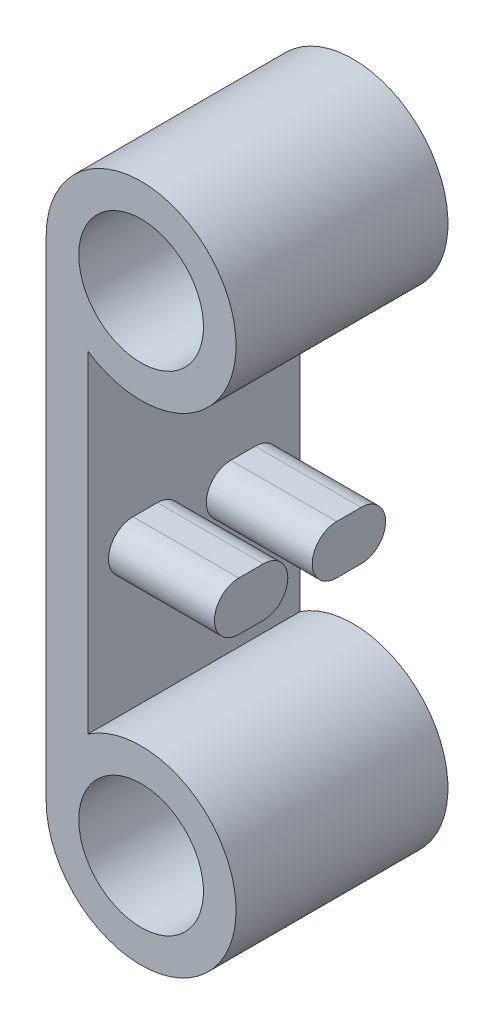
ISO-10303-21;
HEADER;
FILE_DESCRIPTION(('STEP AP214'),'2;1');
FILE_NAME('part.step','',(''),(''),'','','');
FILE_SCHEMA(('AUTOMOTIVE_DESIGN { 1 0 10303 214 1 1 1 1 }'));
ENDSEC;
DATA;
#1=APPLICATION_CONTEXT('core data for automotive mechanical design processes');
#2=APPLICATION_PROTOCOL_DEFINITION('international standard','automotive_design',2000,#1);
#3=PRODUCT_CONTEXT('',#1,'mechanical');
#4=PRODUCT('Part','Part','',(#3));
#5=PRODUCT_RELATED_PRODUCT_CATEGORY('part','',(#4));
#6=PRODUCT_DEFINITION_FORMATION('','',#4);
#7=PRODUCT_DEFINITION_CONTEXT('part definition',#1,'design');
#8=PRODUCT_DEFINITION('design','',#6,#7);
#9=PRODUCT_DEFINITION_SHAPE('','',#8);
#10=(LENGTH_UNIT() NAMED_UNIT(*) SI_UNIT(.MILLI.,.METRE.));
#11=(NAMED_UNIT(*) PLANE_ANGLE_UNIT() SI_UNIT($,.RADIAN.));
#12=(NAMED_UNIT(*) SI_UNIT($,.STERADIAN.) SOLID_ANGLE_UNIT());
#13=UNCERTAINTY_MEASURE_WITH_UNIT(LENGTH_MEASURE(1.E-05),#10,'distance_accuracy_value','');
#14=(GEOMETRIC_REPRESENTATION_CONTEXT(3) GLOBAL_UNCERTAINTY_ASSIGNED_CONTEXT((#13)) GLOBAL_UNIT_ASSIGNED_CONTEXT((#10,
#11,#12)) REPRESENTATION_CONTEXT('',''));
#15=CARTESIAN_POINT('',(0.,0.,0.));
#16=DIRECTION('',(0.,0.,1.));
#17=DIRECTION('',(1.,0.,0.));
#18=AXIS2_PLACEMENT_3D('',#15,#16,#17);
#19=CARTESIAN_POINT('',(-6.50000000000001,20.3318822928142,26.));
#20=DIRECTION('',(-1.,0.,0.));
#21=DIRECTION('',(0.,-1.,0.));
#22=AXIS2_PLACEMENT_3D('',#19,#20,#21);
#23=PLANE('',#22);
#24=CARTESIAN_POINT('',(-6.5,-10.,13.));
#25=DIRECTION('',(-1.,0.,0.));
#26=DIRECTION('',(0.,-1.,0.));
#27=AXIS2_PLACEMENT_3D('',#24,#25,#26);
#28=CIRCLE('',#27,1.5);
#29=CARTESIAN_POINT('',(-6.5,-11.5,13.));
#30=VERTEX_POINT('',#29);
#31=EDGE_CURVE('E175',#30,#30,#28,.T.);
#32=ORIENTED_EDGE('',*,*,#31,.T.);
#33=EDGE_LOOP('',(#32));
#34=FACE_BOUND('',#33,.T.);
#35=CARTESIAN_POINT('',(-6.5,-2.99999999999999,17.5));
#36=DIRECTION('',(1.,0.,0.));
#37=DIRECTION('',(0.,1.,0.));
#38=AXIS2_PLACEMENT_3D('',#35,#36,#37);
#39=CIRCLE('',#38,3.);
#40=CARTESIAN_POINT('',(-6.5,-5.99999999999999,17.5));
#41=VERTEX_POINT('',#40);
#42=CARTESIAN_POINT('',(-6.5,0.,17.5));
#43=VERTEX_POINT('',#42);
#44=EDGE_CURVE('E218',#41,#43,#39,.T.);
#45=ORIENTED_EDGE('',*,*,#44,.F.);
#46=DIRECTION('',(0.,0.,-1.));
#47=VECTOR('',#46,1.);
#48=CARTESIAN_POINT('',(-6.5,-5.99999999999999,17.5));
#49=LINE('',#48,#47);
#50=CARTESIAN_POINT('',(-6.5,-5.99999999999998,20.5));
#51=VERTEX_POINT('',#50);
#52=EDGE_CURVE('E223',#51,#41,#49,.T.);
#53=ORIENTED_EDGE('',*,*,#52,.F.);
#54=CARTESIAN_POINT('',(-6.5,-2.99999999999999,20.5));
#55=DIRECTION('',(1.,0.,0.));
#56=DIRECTION('',(0.,1.,0.));
#57=AXIS2_PLACEMENT_3D('',#54,#55,#56);
#58=CIRCLE('',#57,3.);
#59=CARTESIAN_POINT('',(-6.5,0.,20.5));
#60=VERTEX_POINT('',#59);
#61=EDGE_CURVE('E235',#60,#51,#58,.T.);
#62=ORIENTED_EDGE('',*,*,#61,.F.);
#63=DIRECTION('',(0.,0.,1.));
#64=VECTOR('',#63,1.);
#65=CARTESIAN_POINT('',(-6.5,0.,17.5));
#66=LINE('',#65,#64);
#67=EDGE_CURVE('E232',#43,#60,#66,.T.);
#68=ORIENTED_EDGE('',*,*,#67,.F.);
#69=EDGE_LOOP('',(#45,#53,#62,#68));
#70=FACE_BOUND('',#69,.T.);
#71=DIRECTION('',(0.,1.,0.));
#72=VECTOR('',#71,1.);
#73=CARTESIAN_POINT('',(-6.50000000000001,20.3318822928142,0.));
#74=LINE('',#73,#72);
#75=CARTESIAN_POINT('',(-6.49999999999999,-20.3318822928142,0.));
#76=VERTEX_POINT('',#75);
#77=CARTESIAN_POINT('',(-6.50000000000001,20.3318822928142,0.));
#78=VERTEX_POINT('',#77);
#79=EDGE_CURVE('E268',#76,#78,#74,.T.);
#80=ORIENTED_EDGE('',*,*,#79,.T.);
#81=DIRECTION('',(0.,0.,-1.));
#82=VECTOR('',#81,1.);
#83=CARTESIAN_POINT('',(-6.50000000000001,20.3318822928142,26.));
#84=LINE('',#83,#82);
#85=CARTESIAN_POINT('',(-6.50000000000001,20.3318822928142,26.));
#86=VERTEX_POINT('',#85);
#87=EDGE_CURVE('E274',#86,#78,#84,.T.);
#88=ORIENTED_EDGE('',*,*,#87,.F.);
#89=DIRECTION('',(0.,1.,0.));
#90=VECTOR('',#89,1.);
#91=CARTESIAN_POINT('',(-6.50000000000001,20.3318822928142,26.));
#92=LINE('',#91,#90);
#93=CARTESIAN_POINT('',(-6.49999999999999,-20.3318822928142,26.));
#94=VERTEX_POINT('',#93);
#95=EDGE_CURVE('E272',#94,#86,#92,.T.);
#96=ORIENTED_EDGE('',*,*,#95,.F.);
#97=DIRECTION('',(0.,0.,-1.));
#98=VECTOR('',#97,1.);
#99=CARTESIAN_POINT('',(-6.49999999999999,-20.3318822928142,26.));
#100=LINE('',#99,#98);
#101=EDGE_CURVE('E284',#94,#76,#100,.T.);
#102=ORIENTED_EDGE('',*,*,#101,.T.);
#103=EDGE_LOOP('',(#80,#88,#96,#102));
#104=FACE_BOUND('',#103,.T.);
#105=CARTESIAN_POINT('',(-6.5,-2.99999999999999,8.49999999999999));
#106=DIRECTION('',(1.,0.,0.));
#107=DIRECTION('',(0.,-1.,0.));
#108=AXIS2_PLACEMENT_3D('',#105,#106,#107);
#109=CIRCLE('',#108,3.);
#110=CARTESIAN_POINT('',(-6.5,0.,8.5));
#111=VERTEX_POINT('',#110);
#112=CARTESIAN_POINT('',(-6.5,-5.99999999999998,8.49999999999999));
#113=VERTEX_POINT('',#112);
#114=EDGE_CURVE('E185',#111,#113,#109,.T.);
#115=ORIENTED_EDGE('',*,*,#114,.F.);
#116=DIRECTION('',(0.,0.,1.));
#117=VECTOR('',#116,1.);
#118=CARTESIAN_POINT('',(-6.5,0.,8.5));
#119=LINE('',#118,#117);
#120=CARTESIAN_POINT('',(-6.5,0.,5.5));
#121=VERTEX_POINT('',#120);
#122=EDGE_CURVE('E193',#121,#111,#119,.T.);
#123=ORIENTED_EDGE('',*,*,#122,.F.);
#124=CARTESIAN_POINT('',(-6.5,-2.99999999999999,5.5));
#125=DIRECTION('',(1.,0.,0.));
#126=DIRECTION('',(0.,-1.,0.));
#127=AXIS2_PLACEMENT_3D('',#124,#125,#126);
#128=CIRCLE('',#127,3.);
#129=CARTESIAN_POINT('',(-6.5,-5.99999999999998,5.5));
#130=VERTEX_POINT('',#129);
#131=EDGE_CURVE('E203',#130,#121,#128,.T.);
#132=ORIENTED_EDGE('',*,*,#131,.F.);
#133=DIRECTION('',(0.,0.,-1.));
#134=VECTOR('',#133,1.);
#135=CARTESIAN_POINT('',(-6.5,-5.99999999999999,8.49999999999999));
#136=LINE('',#135,#134);
#137=EDGE_CURVE('E56',#113,#130,#136,.T.);
#138=ORIENTED_EDGE('',*,*,#137,.F.);
#139=EDGE_LOOP('',(#115,#123,#132,#138));
#140=FACE_BOUND('',#139,.T.);
#141=ADVANCED_FACE('F33',(#34,#70,#104,#140),#23,.F.);
#142=CARTESIAN_POINT('',(0.,30.,26.));
#143=DIRECTION('',(0.,0.,1.));
#144=DIRECTION('',(1.,0.,0.));
#145=AXIS2_PLACEMENT_3D('',#142,#143,#144);
#146=PLANE('',#145);
#147=CARTESIAN_POINT('',(0.,30.,26.));
#148=DIRECTION('',(0.,0.,1.));
#149=DIRECTION('',(1.,0.,0.));
#150=AXIS2_PLACEMENT_3D('',#147,#148,#149);
#151=CIRCLE('',#150,7.65);
#152=CARTESIAN_POINT('',(-7.65000000000001,30.,26.));
#153=VERTEX_POINT('',#152);
#154=EDGE_CURVE('E258',#153,#153,#151,.T.);
#155=ORIENTED_EDGE('',*,*,#154,.F.);
#156=EDGE_LOOP('',(#155));
#157=FACE_BOUND('',#156,.T.);
#158=CARTESIAN_POINT('',(0.,30.,26.));
#159=DIRECTION('',(0.,0.,1.));
#160=DIRECTION('',(1.,0.,0.));
#161=AXIS2_PLACEMENT_3D('',#158,#159,#160);
#162=CIRCLE('',#161,11.65);
#163=CARTESIAN_POINT('',(-11.65,30.,26.));
#164=VERTEX_POINT('',#163);
#165=EDGE_CURVE('E264',#86,#164,#162,.T.);
#166=ORIENTED_EDGE('',*,*,#165,.T.);
#167=DIRECTION('',(0.,-1.,0.));
#168=VECTOR('',#167,1.);
#169=CARTESIAN_POINT('',(-11.65,30.,26.));
#170=LINE('',#169,#168);
#171=CARTESIAN_POINT('',(-11.65,-30.,26.));
#172=VERTEX_POINT('',#171);
#173=EDGE_CURVE('E267',#164,#172,#170,.T.);
#174=ORIENTED_EDGE('',*,*,#173,.T.);
#175=CARTESIAN_POINT('',(0.,-30.,26.));
#176=DIRECTION('',(0.,0.,1.));
#177=DIRECTION('',(1.,0.,0.));
#178=AXIS2_PLACEMENT_3D('',#175,#176,#177);
#179=CIRCLE('',#178,11.65);
#180=EDGE_CURVE('E270',#172,#94,#179,.T.);
#181=ORIENTED_EDGE('',*,*,#180,.T.);
#182=ORIENTED_EDGE('',*,*,#95,.T.);
#183=EDGE_LOOP('',(#166,#174,#181,#182));
#184=FACE_BOUND('',#183,.T.);
#185=CARTESIAN_POINT('',(0.,-30.,26.));
#186=DIRECTION('',(0.,0.,1.));
#187=DIRECTION('',(1.,0.,0.));
#188=AXIS2_PLACEMENT_3D('',#185,#186,#187);
#189=CIRCLE('',#188,7.65);
#190=CARTESIAN_POINT('',(-7.64999999999999,-30.,26.));
#191=VERTEX_POINT('',#190);
#192=EDGE_CURVE('E252',#191,#191,#189,.T.);
#193=ORIENTED_EDGE('',*,*,#192,.F.);
#194=EDGE_LOOP('',(#193));
#195=FACE_BOUND('',#194,.T.);
#196=ADVANCED_FACE('F306',(#157,#184,#195),#146,.T.);
#197=CARTESIAN_POINT('',(0.,30.,0.));
#198=DIRECTION('',(0.,0.,1.));
#199=DIRECTION('',(1.,0.,0.));
#200=AXIS2_PLACEMENT_3D('',#197,#198,#199);
#201=PLANE('',#200);
#202=CARTESIAN_POINT('',(0.,30.,0.));
#203=DIRECTION('',(0.,0.,1.));
#204=DIRECTION('',(1.,0.,0.));
#205=AXIS2_PLACEMENT_3D('',#202,#203,#204);
#206=CIRCLE('',#205,11.65);
#207=CARTESIAN_POINT('',(-11.65,30.,0.));
#208=VERTEX_POINT('',#207);
#209=EDGE_CURVE('E261',#78,#208,#206,.T.);
#210=ORIENTED_EDGE('',*,*,#209,.F.);
#211=ORIENTED_EDGE('',*,*,#79,.F.);
#212=CARTESIAN_POINT('',(0.,-30.,0.));
#213=DIRECTION('',(0.,0.,1.));
#214=DIRECTION('',(1.,0.,0.));
#215=AXIS2_PLACEMENT_3D('',#212,#213,#214);
#216=CIRCLE('',#215,11.65);
#217=CARTESIAN_POINT('',(-11.65,-30.,0.));
#218=VERTEX_POINT('',#217);
#219=EDGE_CURVE('E279',#218,#76,#216,.T.);
#220=ORIENTED_EDGE('',*,*,#219,.F.);
#221=DIRECTION('',(0.,-1.,0.));
#222=VECTOR('',#221,1.);
#223=CARTESIAN_POINT('',(-11.65,28.,0.));
#224=LINE('',#223,#222);
#225=EDGE_CURVE('E277',#208,#218,#224,.T.);
#226=ORIENTED_EDGE('',*,*,#225,.F.);
#227=EDGE_LOOP('',(#210,#211,#220,#226));
#228=FACE_BOUND('',#227,.T.);
#229=CARTESIAN_POINT('',(0.,30.,0.));
#230=DIRECTION('',(0.,0.,1.));
#231=DIRECTION('',(1.,0.,0.));
#232=AXIS2_PLACEMENT_3D('',#229,#230,#231);
#233=CIRCLE('',#232,7.65);
#234=CARTESIAN_POINT('',(-7.65000000000001,30.,0.));
#235=VERTEX_POINT('',#234);
#236=EDGE_CURVE('E255',#235,#235,#233,.T.);
#237=ORIENTED_EDGE('',*,*,#236,.T.);
#238=EDGE_LOOP('',(#237));
#239=FACE_BOUND('',#238,.T.);
#240=CARTESIAN_POINT('',(0.,-30.,0.));
#241=DIRECTION('',(0.,0.,1.));
#242=DIRECTION('',(1.,0.,0.));
#243=AXIS2_PLACEMENT_3D('',#240,#241,#242);
#244=CIRCLE('',#243,7.65);
#245=CARTESIAN_POINT('',(-7.64999999999999,-30.,0.));
#246=VERTEX_POINT('',#245);
#247=EDGE_CURVE('E251',#246,#246,#244,.T.);
#248=ORIENTED_EDGE('',*,*,#247,.T.);
#249=EDGE_LOOP('',(#248));
#250=FACE_BOUND('',#249,.T.);
#251=ADVANCED_FACE('F297',(#228,#239,#250),#201,.F.);
#252=CARTESIAN_POINT('',(0.,30.,26.));
#253=DIRECTION('',(0.,0.,-1.));
#254=DIRECTION('',(-1.,0.,0.));
#255=AXIS2_PLACEMENT_3D('',#252,#253,#254);
#256=CYLINDRICAL_SURFACE('',#255,11.65);
#257=ORIENTED_EDGE('',*,*,#209,.T.);
#258=DIRECTION('',(0.,0.,-1.));
#259=VECTOR('',#258,1.);
#260=CARTESIAN_POINT('',(-11.65,30.,26.));
#261=LINE('',#260,#259);
#262=EDGE_CURVE('E11',#164,#208,#261,.T.);
#263=ORIENTED_EDGE('',*,*,#262,.F.);
#264=ORIENTED_EDGE('',*,*,#165,.F.);
#265=ORIENTED_EDGE('',*,*,#87,.T.);
#266=EDGE_LOOP('',(#257,#263,#264,#265));
#267=FACE_BOUND('',#266,.T.);
#268=ADVANCED_FACE('F35',(#267),#256,.T.);
#269=CARTESIAN_POINT('',(-11.65,28.,26.));
#270=DIRECTION('',(1.,0.,0.));
#271=DIRECTION('',(0.,1.,0.));
#272=AXIS2_PLACEMENT_3D('',#269,#270,#271);
#273=PLANE('',#272);
#274=DIRECTION('',(0.,0.,1.));
#275=VECTOR('',#274,1.);
#276=CARTESIAN_POINT('',(-11.65,-22.5,5.5));
#277=LINE('',#276,#275);
#278=CARTESIAN_POINT('',(-11.65,-22.5,5.5));
#279=VERTEX_POINT('',#278);
#280=CARTESIAN_POINT('',(-11.65,-22.5,20.5));
#281=VERTEX_POINT('',#280);
#282=EDGE_CURVE('E171',#279,#281,#277,.T.);
#283=ORIENTED_EDGE('',*,*,#282,.F.);
#284=DIRECTION('',(0.,1.,0.));
#285=VECTOR('',#284,1.);
#286=CARTESIAN_POINT('',(-11.65,-22.5,5.5));
#287=LINE('',#286,#285);
#288=CARTESIAN_POINT('',(-11.65,2.5,5.5));
#289=VERTEX_POINT('',#288);
#290=EDGE_CURVE('E180',#279,#289,#287,.T.);
#291=ORIENTED_EDGE('',*,*,#290,.T.);
#292=DIRECTION('',(0.,0.,1.));
#293=VECTOR('',#292,1.);
#294=CARTESIAN_POINT('',(-11.65,2.5,5.5));
#295=LINE('',#294,#293);
#296=CARTESIAN_POINT('',(-11.65,2.5,20.5));
#297=VERTEX_POINT('',#296);
#298=EDGE_CURVE('E153',#289,#297,#295,.T.);
#299=ORIENTED_EDGE('',*,*,#298,.T.);
#300=DIRECTION('',(0.,1.,0.));
#301=VECTOR('',#300,1.);
#302=CARTESIAN_POINT('',(-11.65,-22.5,20.5));
#303=LINE('',#302,#301);
#304=EDGE_CURVE('E48',#281,#297,#303,.T.);
#305=ORIENTED_EDGE('',*,*,#304,.F.);
#306=EDGE_LOOP('',(#283,#291,#299,#305));
#307=FACE_BOUND('',#306,.T.);
#308=ORIENTED_EDGE('',*,*,#225,.T.);
#309=DIRECTION('',(0.,0.,-1.));
#310=VECTOR('',#309,1.);
#311=CARTESIAN_POINT('',(-11.65,-30.,26.));
#312=LINE('',#311,#310);
#313=EDGE_CURVE('E41',#172,#218,#312,.T.);
#314=ORIENTED_EDGE('',*,*,#313,.F.);
#315=ORIENTED_EDGE('',*,*,#173,.F.);
#316=ORIENTED_EDGE('',*,*,#262,.T.);
#317=EDGE_LOOP('',(#308,#314,#315,#316));
#318=FACE_BOUND('',#317,.T.);
#319=ADVANCED_FACE('F308',(#307,#318),#273,.F.);
#320=CARTESIAN_POINT('',(0.,-30.,26.));
#321=DIRECTION('',(0.,0.,-1.));
#322=DIRECTION('',(-1.,0.,0.));
#323=AXIS2_PLACEMENT_3D('',#320,#321,#322);
#324=CYLINDRICAL_SURFACE('',#323,11.65);
#325=ORIENTED_EDGE('',*,*,#219,.T.);
#326=ORIENTED_EDGE('',*,*,#101,.F.);
#327=ORIENTED_EDGE('',*,*,#180,.F.);
#328=ORIENTED_EDGE('',*,*,#313,.T.);
#329=EDGE_LOOP('',(#325,#326,#327,#328));
#330=FACE_BOUND('',#329,.T.);
#331=ADVANCED_FACE('F291',(#330),#324,.T.);
#332=CARTESIAN_POINT('',(0.,30.,26.));
#333=DIRECTION('',(0.,0.,-1.));
#334=DIRECTION('',(-1.,0.,0.));
#335=AXIS2_PLACEMENT_3D('',#332,#333,#334);
#336=CYLINDRICAL_SURFACE('',#335,7.65);
#337=CARTESIAN_POINT('',(-7.65000000000001,30.,26.));
#338=CARTESIAN_POINT('',(-7.65000000000001,30.,25.7291666666667));
#339=CARTESIAN_POINT('',(-7.65000000000001,30.,25.4583333333333));
#340=CARTESIAN_POINT('',(-7.65000000000001,30.,24.9166666666667));
#341=CARTESIAN_POINT('',(-7.65000000000001,30.,24.6458333333333));
#342=CARTESIAN_POINT('',(-7.65000000000001,30.,24.1041666666667));
#343=CARTESIAN_POINT('',(-7.65000000000001,30.,23.8333333333333));
#344=CARTESIAN_POINT('',(-7.65000000000001,30.,23.2916666666667));
#345=CARTESIAN_POINT('',(-7.65000000000001,30.,23.0208333333333));
#346=CARTESIAN_POINT('',(-7.65000000000001,30.,22.4791666666667));
#347=CARTESIAN_POINT('',(-7.65000000000001,30.,22.2083333333333));
#348=CARTESIAN_POINT('',(-7.65000000000001,30.,21.6666666666667));
#349=CARTESIAN_POINT('',(-7.65000000000001,30.,21.3958333333333));
#350=CARTESIAN_POINT('',(-7.65000000000001,30.,20.8541666666667));
#351=CARTESIAN_POINT('',(-7.65000000000001,30.,20.5833333333333));
#352=CARTESIAN_POINT('',(-7.65000000000001,30.,20.0416666666667));
#353=CARTESIAN_POINT('',(-7.65000000000001,30.,19.7708333333333));
#354=CARTESIAN_POINT('',(-7.65000000000001,30.,19.2291666666667));
#355=CARTESIAN_POINT('',(-7.65000000000001,30.,18.9583333333333));
#356=CARTESIAN_POINT('',(-7.65000000000001,30.,18.4166666666667));
#357=CARTESIAN_POINT('',(-7.65000000000001,30.,18.1458333333333));
#358=CARTESIAN_POINT('',(-7.65000000000001,30.,17.6041666666667));
#359=CARTESIAN_POINT('',(-7.65000000000001,30.,17.3333333333333));
#360=CARTESIAN_POINT('',(-7.65000000000001,30.,16.7916666666667));
#361=CARTESIAN_POINT('',(-7.65000000000001,30.,16.5208333333333));
#362=CARTESIAN_POINT('',(-7.65000000000001,30.,15.9791666666667));
#363=CARTESIAN_POINT('',(-7.65000000000001,30.,15.7083333333333));
#364=CARTESIAN_POINT('',(-7.65000000000001,30.,15.1666666666667));
#365=CARTESIAN_POINT('',(-7.65000000000001,30.,14.8958333333333));
#366=CARTESIAN_POINT('',(-7.65000000000001,30.,14.3541666666667));
#367=CARTESIAN_POINT('',(-7.65000000000001,30.,14.0833333333333));
#368=CARTESIAN_POINT('',(-7.65000000000001,30.,13.5416666666667));
#369=CARTESIAN_POINT('',(-7.65000000000001,30.,13.2708333333333));
#370=CARTESIAN_POINT('',(-7.65000000000001,30.,12.7291666666667));
#371=CARTESIAN_POINT('',(-7.65000000000001,30.,12.4583333333333));
#372=CARTESIAN_POINT('',(-7.65000000000001,30.,11.9166666666667));
#373=CARTESIAN_POINT('',(-7.65000000000001,30.,11.6458333333333));
#374=CARTESIAN_POINT('',(-7.65000000000001,30.,11.1041666666667));
#375=CARTESIAN_POINT('',(-7.65000000000001,30.,10.8333333333333));
#376=CARTESIAN_POINT('',(-7.65000000000001,30.,10.2916666666667));
#377=CARTESIAN_POINT('',(-7.65000000000001,30.,10.0208333333333));
#378=CARTESIAN_POINT('',(-7.65000000000001,30.,9.47916666666667));
#379=CARTESIAN_POINT('',(-7.65000000000001,30.,9.20833333333333));
#380=CARTESIAN_POINT('',(-7.65000000000001,30.,8.66666666666667));
#381=CARTESIAN_POINT('',(-7.65000000000001,30.,8.39583333333333));
#382=CARTESIAN_POINT('',(-7.65000000000001,30.,7.85416666666667));
#383=CARTESIAN_POINT('',(-7.65000000000001,30.,7.58333333333333));
#384=CARTESIAN_POINT('',(-7.65000000000001,30.,7.04166666666667));
#385=CARTESIAN_POINT('',(-7.65000000000001,30.,6.77083333333333));
#386=CARTESIAN_POINT('',(-7.65000000000001,30.,6.22916666666667));
#387=CARTESIAN_POINT('',(-7.65000000000001,30.,5.95833333333333));
#388=CARTESIAN_POINT('',(-7.65000000000001,30.,5.41666666666667));
#389=CARTESIAN_POINT('',(-7.65000000000001,30.,5.14583333333333));
#390=CARTESIAN_POINT('',(-7.65000000000001,30.,4.60416666666667));
#391=CARTESIAN_POINT('',(-7.65000000000001,30.,4.33333333333333));
#392=CARTESIAN_POINT('',(-7.65000000000001,30.,3.79166666666667));
#393=CARTESIAN_POINT('',(-7.65000000000001,30.,3.52083333333333));
#394=CARTESIAN_POINT('',(-7.65000000000001,30.,2.97916666666667));
#395=CARTESIAN_POINT('',(-7.65000000000001,30.,2.70833333333333));
#396=CARTESIAN_POINT('',(-7.65000000000001,30.,2.16666666666667));
#397=CARTESIAN_POINT('',(-7.65000000000001,30.,1.89583333333333));
#398=CARTESIAN_POINT('',(-7.65000000000001,30.,1.35416666666667));
#399=CARTESIAN_POINT('',(-7.65000000000001,30.,1.08333333333333));
#400=CARTESIAN_POINT('',(-7.65000000000001,30.,0.541666666666667));
#401=CARTESIAN_POINT('',(-7.65000000000001,30.,0.270833333333334));
#402=CARTESIAN_POINT('',(-7.65000000000001,30.,0.));
#403=B_SPLINE_CURVE_WITH_KNOTS('',3,(#337,#338,#339,#340,#341,#342,#343,#344,#345,#346,#347,
#348,#349,#350,#351,#352,#353,#354,#355,#356,#357,#358,#359,#360,#361,#362,#363,#364,#365,#366,
#367,#368,#369,#370,#371,#372,#373,#374,#375,#376,#377,#378,#379,#380,#381,#382,#383,#384,#385,
#386,#387,#388,#389,#390,#391,#392,#393,#394,#395,#396,#397,#398,#399,#400,#401,#402),
.UNSPECIFIED.,.F.,.F.,(4,2,2,2,2,2,2,2,2,2,2,2,2,2,2,2,2,2,2,2,2,2,2,2,2,2,2,2,2,2,2,2,4),(0.,
0.812500000000001,1.625,2.4375,3.25,4.0625,4.875,5.6875,6.5,7.3125,8.125,8.9375,9.75,10.5625,
11.375,12.1875,13.,13.8125,14.625,15.4375,16.25,17.0625,17.875,18.6875,19.5,20.3125,21.125,
21.9375,22.75,23.5625,24.375,25.1875,26.),.UNSPECIFIED.);
#404=EDGE_CURVE('BSEAM315',#153,#235,#403,.T.);
#405=ORIENTED_EDGE('',*,*,#154,.T.);
#406=ORIENTED_EDGE('',*,*,#236,.F.);
#407=ORIENTED_EDGE('',*,*,#404,.T.);
#408=ORIENTED_EDGE('',*,*,#404,.F.);
#409=EDGE_LOOP('',(#405,#407,#406,#408));
#410=FACE_BOUND('',#409,.T.);
#411=ADVANCED_FACE('F315',(#410),#336,.F.);
#412=CARTESIAN_POINT('',(0.,-30.,26.));
#413=DIRECTION('',(0.,0.,-1.));
#414=DIRECTION('',(-1.,0.,0.));
#415=AXIS2_PLACEMENT_3D('',#412,#413,#414);
#416=CYLINDRICAL_SURFACE('',#415,7.65);
#417=CARTESIAN_POINT('',(-7.64999999999999,-30.,26.));
#418=CARTESIAN_POINT('',(-7.64999999999999,-30.,25.7291666666667));
#419=CARTESIAN_POINT('',(-7.64999999999999,-30.,25.4583333333333));
#420=CARTESIAN_POINT('',(-7.64999999999999,-30.,24.9166666666667));
#421=CARTESIAN_POINT('',(-7.64999999999999,-30.,24.6458333333333));
#422=CARTESIAN_POINT('',(-7.64999999999999,-30.,24.1041666666667));
#423=CARTESIAN_POINT('',(-7.64999999999999,-30.,23.8333333333333));
#424=CARTESIAN_POINT('',(-7.64999999999999,-30.,23.2916666666667));
#425=CARTESIAN_POINT('',(-7.64999999999999,-30.,23.0208333333333));
#426=CARTESIAN_POINT('',(-7.64999999999999,-30.,22.4791666666667));
#427=CARTESIAN_POINT('',(-7.64999999999999,-30.,22.2083333333333));
#428=CARTESIAN_POINT('',(-7.64999999999999,-30.,21.6666666666667));
#429=CARTESIAN_POINT('',(-7.64999999999999,-30.,21.3958333333333));
#430=CARTESIAN_POINT('',(-7.64999999999999,-30.,20.8541666666667));
#431=CARTESIAN_POINT('',(-7.64999999999999,-30.,20.5833333333333));
#432=CARTESIAN_POINT('',(-7.64999999999999,-30.,20.0416666666667));
#433=CARTESIAN_POINT('',(-7.64999999999999,-30.,19.7708333333333));
#434=CARTESIAN_POINT('',(-7.64999999999999,-30.,19.2291666666667));
#435=CARTESIAN_POINT('',(-7.64999999999999,-30.,18.9583333333333));
#436=CARTESIAN_POINT('',(-7.64999999999999,-30.,18.4166666666667));
#437=CARTESIAN_POINT('',(-7.64999999999999,-30.,18.1458333333333));
#438=CARTESIAN_POINT('',(-7.64999999999999,-30.,17.6041666666667));
#439=CARTESIAN_POINT('',(-7.64999999999999,-30.,17.3333333333333));
#440=CARTESIAN_POINT('',(-7.64999999999999,-30.,16.7916666666667));
#441=CARTESIAN_POINT('',(-7.64999999999999,-30.,16.5208333333333));
#442=CARTESIAN_POINT('',(-7.64999999999999,-30.,15.9791666666667));
#443=CARTESIAN_POINT('',(-7.64999999999999,-30.,15.7083333333333));
#444=CARTESIAN_POINT('',(-7.64999999999999,-30.,15.1666666666667));
#445=CARTESIAN_POINT('',(-7.64999999999999,-30.,14.8958333333333));
#446=CARTESIAN_POINT('',(-7.64999999999999,-30.,14.3541666666667));
#447=CARTESIAN_POINT('',(-7.64999999999999,-30.,14.0833333333333));
#448=CARTESIAN_POINT('',(-7.64999999999999,-30.,13.5416666666667));
#449=CARTESIAN_POINT('',(-7.64999999999999,-30.,13.2708333333333));
#450=CARTESIAN_POINT('',(-7.64999999999999,-30.,12.7291666666667));
#451=CARTESIAN_POINT('',(-7.64999999999999,-30.,12.4583333333333));
#452=CARTESIAN_POINT('',(-7.64999999999999,-30.,11.9166666666667));
#453=CARTESIAN_POINT('',(-7.64999999999999,-30.,11.6458333333333));
#454=CARTESIAN_POINT('',(-7.64999999999999,-30.,11.1041666666667));
#455=CARTESIAN_POINT('',(-7.64999999999999,-30.,10.8333333333333));
#456=CARTESIAN_POINT('',(-7.64999999999999,-30.,10.2916666666667));
#457=CARTESIAN_POINT('',(-7.64999999999999,-30.,10.0208333333333));
#458=CARTESIAN_POINT('',(-7.64999999999999,-30.,9.47916666666667));
#459=CARTESIAN_POINT('',(-7.64999999999999,-30.,9.20833333333333));
#460=CARTESIAN_POINT('',(-7.64999999999999,-30.,8.66666666666667));
#461=CARTESIAN_POINT('',(-7.64999999999999,-30.,8.39583333333333));
#462=CARTESIAN_POINT('',(-7.64999999999999,-30.,7.85416666666667));
#463=CARTESIAN_POINT('',(-7.64999999999999,-30.,7.58333333333333));
#464=CARTESIAN_POINT('',(-7.64999999999999,-30.,7.04166666666667));
#465=CARTESIAN_POINT('',(-7.64999999999999,-30.,6.77083333333333));
#466=CARTESIAN_POINT('',(-7.64999999999999,-30.,6.22916666666667));
#467=CARTESIAN_POINT('',(-7.64999999999999,-30.,5.95833333333333));
#468=CARTESIAN_POINT('',(-7.64999999999999,-30.,5.41666666666667));
#469=CARTESIAN_POINT('',(-7.64999999999999,-30.,5.14583333333333));
#470=CARTESIAN_POINT('',(-7.64999999999999,-30.,4.60416666666667));
#471=CARTESIAN_POINT('',(-7.64999999999999,-30.,4.33333333333333));
#472=CARTESIAN_POINT('',(-7.64999999999999,-30.,3.79166666666667));
#473=CARTESIAN_POINT('',(-7.64999999999999,-30.,3.52083333333333));
#474=CARTESIAN_POINT('',(-7.64999999999999,-30.,2.97916666666667));
#475=CARTESIAN_POINT('',(-7.64999999999999,-30.,2.70833333333333));
#476=CARTESIAN_POINT('',(-7.64999999999999,-30.,2.16666666666667));
#477=CARTESIAN_POINT('',(-7.64999999999999,-30.,1.89583333333333));
#478=CARTESIAN_POINT('',(-7.64999999999999,-30.,1.35416666666667));
#479=CARTESIAN_POINT('',(-7.64999999999999,-30.,1.08333333333333));
#480=CARTESIAN_POINT('',(-7.64999999999999,-30.,0.541666666666667));
#481=CARTESIAN_POINT('',(-7.64999999999999,-30.,0.270833333333334));
#482=CARTESIAN_POINT('',(-7.64999999999999,-30.,0.));
#483=B_SPLINE_CURVE_WITH_KNOTS('',3,(#417,#418,#419,#420,#421,#422,#423,#424,#425,#426,#427,
#428,#429,#430,#431,#432,#433,#434,#435,#436,#437,#438,#439,#440,#441,#442,#443,#444,#445,#446,
#447,#448,#449,#450,#451,#452,#453,#454,#455,#456,#457,#458,#459,#460,#461,#462,#463,#464,#465,
#466,#467,#468,#469,#470,#471,#472,#473,#474,#475,#476,#477,#478,#479,#480,#481,#482),
.UNSPECIFIED.,.F.,.F.,(4,2,2,2,2,2,2,2,2,2,2,2,2,2,2,2,2,2,2,2,2,2,2,2,2,2,2,2,2,2,2,2,4),(0.,
0.812500000000001,1.625,2.4375,3.25,4.0625,4.875,5.6875,6.5,7.3125,8.125,8.9375,9.75,10.5625,
11.375,12.1875,13.,13.8125,14.625,15.4375,16.25,17.0625,17.875,18.6875,19.5,20.3125,21.125,
21.9375,22.75,23.5625,24.375,25.1875,26.),.UNSPECIFIED.);
#484=EDGE_CURVE('BSEAM333',#191,#246,#483,.T.);
#485=ORIENTED_EDGE('',*,*,#192,.T.);
#486=ORIENTED_EDGE('',*,*,#247,.F.);
#487=ORIENTED_EDGE('',*,*,#484,.T.);
#488=ORIENTED_EDGE('',*,*,#484,.F.);
#489=EDGE_LOOP('',(#485,#487,#486,#488));
#490=FACE_BOUND('',#489,.T.);
#491=ADVANCED_FACE('F333',(#490),#416,.F.);
#492=CARTESIAN_POINT('',(6.5,-2.99999999999998,17.5));
#493=DIRECTION('',(-1.,0.,0.));
#494=DIRECTION('',(0.,-1.,0.));
#495=AXIS2_PLACEMENT_3D('',#492,#493,#494);
#496=CYLINDRICAL_SURFACE('',#495,3.);
#497=ORIENTED_EDGE('',*,*,#44,.T.);
#498=DIRECTION('',(-1.,0.,0.));
#499=VECTOR('',#498,1.);
#500=CARTESIAN_POINT('',(6.5,0.,17.5));
#501=LINE('',#500,#499);
#502=CARTESIAN_POINT('',(6.5,0.,17.5));
#503=VERTEX_POINT('',#502);
#504=EDGE_CURVE('E248',#503,#43,#501,.T.);
#505=ORIENTED_EDGE('',*,*,#504,.F.);
#506=CARTESIAN_POINT('',(6.5,-2.99999999999998,17.5));
#507=DIRECTION('',(1.,0.,0.));
#508=DIRECTION('',(0.,1.,0.));
#509=AXIS2_PLACEMENT_3D('',#506,#507,#508);
#510=CIRCLE('',#509,3.);
#511=CARTESIAN_POINT('',(6.5,-5.99999999999998,17.5));
#512=VERTEX_POINT('',#511);
#513=EDGE_CURVE('E219',#512,#503,#510,.T.);
#514=ORIENTED_EDGE('',*,*,#513,.F.);
#515=DIRECTION('',(-1.,0.,0.));
#516=VECTOR('',#515,1.);
#517=CARTESIAN_POINT('',(6.5,-5.99999999999998,17.5));
#518=LINE('',#517,#516);
#519=EDGE_CURVE('E229',#512,#41,#518,.T.);
#520=ORIENTED_EDGE('',*,*,#519,.T.);
#521=EDGE_LOOP('',(#497,#505,#514,#520));
#522=FACE_BOUND('',#521,.T.);
#523=ADVANCED_FACE('F337',(#522),#496,.T.);
#524=CARTESIAN_POINT('',(6.5,0.,17.5));
#525=DIRECTION('',(0.,-1.,0.));
#526=DIRECTION('',(1.,0.,0.));
#527=AXIS2_PLACEMENT_3D('',#524,#525,#526);
#528=PLANE('',#527);
#529=ORIENTED_EDGE('',*,*,#67,.T.);
#530=DIRECTION('',(-1.,0.,0.));
#531=VECTOR('',#530,1.);
#532=CARTESIAN_POINT('',(6.5,0.,20.5));
#533=LINE('',#532,#531);
#534=CARTESIAN_POINT('',(6.5,0.,20.5));
#535=VERTEX_POINT('',#534);
#536=EDGE_CURVE('E245',#535,#60,#533,.T.);
#537=ORIENTED_EDGE('',*,*,#536,.F.);
#538=DIRECTION('',(0.,0.,1.));
#539=VECTOR('',#538,1.);
#540=CARTESIAN_POINT('',(6.5,0.,17.5));
#541=LINE('',#540,#539);
#542=EDGE_CURVE('E222',#503,#535,#541,.T.);
#543=ORIENTED_EDGE('',*,*,#542,.F.);
#544=ORIENTED_EDGE('',*,*,#504,.T.);
#545=EDGE_LOOP('',(#529,#537,#543,#544));
#546=FACE_BOUND('',#545,.T.);
#547=ADVANCED_FACE('F341',(#546),#528,.F.);
#548=CARTESIAN_POINT('',(6.5,-2.99999999999998,20.5));
#549=DIRECTION('',(-1.,0.,0.));
#550=DIRECTION('',(0.,-1.,0.));
#551=AXIS2_PLACEMENT_3D('',#548,#549,#550);
#552=CYLINDRICAL_SURFACE('',#551,3.);
#553=ORIENTED_EDGE('',*,*,#61,.T.);
#554=DIRECTION('',(-1.,0.,0.));
#555=VECTOR('',#554,1.);
#556=CARTESIAN_POINT('',(6.5,-5.99999999999998,20.5));
#557=LINE('',#556,#555);
#558=CARTESIAN_POINT('',(6.5,-5.99999999999998,20.5));
#559=VERTEX_POINT('',#558);
#560=EDGE_CURVE('E242',#559,#51,#557,.T.);
#561=ORIENTED_EDGE('',*,*,#560,.F.);
#562=CARTESIAN_POINT('',(6.5,-2.99999999999998,20.5));
#563=DIRECTION('',(1.,0.,0.));
#564=DIRECTION('',(0.,1.,0.));
#565=AXIS2_PLACEMENT_3D('',#562,#563,#564);
#566=CIRCLE('',#565,3.);
#567=EDGE_CURVE('E225',#535,#559,#566,.T.);
#568=ORIENTED_EDGE('',*,*,#567,.F.);
#569=ORIENTED_EDGE('',*,*,#536,.T.);
#570=EDGE_LOOP('',(#553,#561,#568,#569));
#571=FACE_BOUND('',#570,.T.);
#572=ADVANCED_FACE('F345',(#571),#552,.T.);
#573=CARTESIAN_POINT('',(6.5,-5.99999999999998,17.5));
#574=DIRECTION('',(0.,1.,0.));
#575=DIRECTION('',(-1.,0.,0.));
#576=AXIS2_PLACEMENT_3D('',#573,#574,#575);
#577=PLANE('',#576);
#578=ORIENTED_EDGE('',*,*,#52,.T.);
#579=ORIENTED_EDGE('',*,*,#519,.F.);
#580=DIRECTION('',(0.,0.,-1.));
#581=VECTOR('',#580,1.);
#582=CARTESIAN_POINT('',(6.5,-5.99999999999998,17.5));
#583=LINE('',#582,#581);
#584=EDGE_CURVE('E227',#559,#512,#583,.T.);
#585=ORIENTED_EDGE('',*,*,#584,.F.);
#586=ORIENTED_EDGE('',*,*,#560,.T.);
#587=EDGE_LOOP('',(#578,#579,#585,#586));
#588=FACE_BOUND('',#587,.T.);
#589=ADVANCED_FACE('F349',(#588),#577,.F.);
#590=CARTESIAN_POINT('',(6.5,-2.99999999999998,17.5));
#591=DIRECTION('',(1.,0.,0.));
#592=DIRECTION('',(0.,1.,0.));
#593=AXIS2_PLACEMENT_3D('',#590,#591,#592);
#594=PLANE('',#593);
#595=ORIENTED_EDGE('',*,*,#513,.T.);
#596=ORIENTED_EDGE('',*,*,#542,.T.);
#597=ORIENTED_EDGE('',*,*,#567,.T.);
#598=ORIENTED_EDGE('',*,*,#584,.T.);
#599=EDGE_LOOP('',(#595,#596,#597,#598));
#600=FACE_BOUND('',#599,.T.);
#601=ADVANCED_FACE('F353',(#600),#594,.T.);
#602=CARTESIAN_POINT('',(6.5,-2.99999999999998,8.49999999999999));
#603=DIRECTION('',(-1.,0.,0.));
#604=DIRECTION('',(0.,-1.,0.));
#605=AXIS2_PLACEMENT_3D('',#602,#603,#604);
#606=CYLINDRICAL_SURFACE('',#605,3.);
#607=ORIENTED_EDGE('',*,*,#114,.T.);
#608=DIRECTION('',(-1.,0.,0.));
#609=VECTOR('',#608,1.);
#610=CARTESIAN_POINT('',(6.5,-5.99999999999998,8.49999999999999));
#611=LINE('',#610,#609);
#612=CARTESIAN_POINT('',(6.5,-5.99999999999998,8.49999999999999));
#613=VERTEX_POINT('',#612);
#614=EDGE_CURVE('E216',#613,#113,#611,.T.);
#615=ORIENTED_EDGE('',*,*,#614,.F.);
#616=CARTESIAN_POINT('',(6.5,-2.99999999999998,8.49999999999999));
#617=DIRECTION('',(1.,0.,0.));
#618=DIRECTION('',(0.,-1.,0.));
#619=AXIS2_PLACEMENT_3D('',#616,#617,#618);
#620=CIRCLE('',#619,3.);
#621=CARTESIAN_POINT('',(6.5,0.,8.5));
#622=VERTEX_POINT('',#621);
#623=EDGE_CURVE('E189',#622,#613,#620,.T.);
#624=ORIENTED_EDGE('',*,*,#623,.F.);
#625=DIRECTION('',(-1.,0.,0.));
#626=VECTOR('',#625,1.);
#627=CARTESIAN_POINT('',(6.5,0.,8.5));
#628=LINE('',#627,#626);
#629=EDGE_CURVE('E199',#622,#111,#628,.T.);
#630=ORIENTED_EDGE('',*,*,#629,.T.);
#631=EDGE_LOOP('',(#607,#615,#624,#630));
#632=FACE_BOUND('',#631,.T.);
#633=ADVANCED_FACE('F357',(#632),#606,.T.);
#634=CARTESIAN_POINT('',(6.5,-5.99999999999998,8.49999999999999));
#635=DIRECTION('',(0.,1.,0.));
#636=DIRECTION('',(-1.,0.,0.));
#637=AXIS2_PLACEMENT_3D('',#634,#635,#636);
#638=PLANE('',#637);
#639=ORIENTED_EDGE('',*,*,#137,.T.);
#640=DIRECTION('',(-1.,0.,0.));
#641=VECTOR('',#640,1.);
#642=CARTESIAN_POINT('',(6.5,-5.99999999999998,5.5));
#643=LINE('',#642,#641);
#644=CARTESIAN_POINT('',(6.5,-5.99999999999998,5.5));
#645=VERTEX_POINT('',#644);
#646=EDGE_CURVE('E213',#645,#130,#643,.T.);
#647=ORIENTED_EDGE('',*,*,#646,.F.);
#648=DIRECTION('',(0.,0.,-1.));
#649=VECTOR('',#648,1.);
#650=CARTESIAN_POINT('',(6.5,-5.99999999999998,8.49999999999999));
#651=LINE('',#650,#649);
#652=EDGE_CURVE('E192',#613,#645,#651,.T.);
#653=ORIENTED_EDGE('',*,*,#652,.F.);
#654=ORIENTED_EDGE('',*,*,#614,.T.);
#655=EDGE_LOOP('',(#639,#647,#653,#654));
#656=FACE_BOUND('',#655,.T.);
#657=ADVANCED_FACE('F361',(#656),#638,.F.);
#658=CARTESIAN_POINT('',(6.5,-2.99999999999998,5.5));
#659=DIRECTION('',(-1.,0.,0.));
#660=DIRECTION('',(0.,-1.,0.));
#661=AXIS2_PLACEMENT_3D('',#658,#659,#660);
#662=CYLINDRICAL_SURFACE('',#661,3.);
#663=ORIENTED_EDGE('',*,*,#131,.T.);
#664=DIRECTION('',(-1.,0.,0.));
#665=VECTOR('',#664,1.);
#666=CARTESIAN_POINT('',(6.5,0.,5.5));
#667=LINE('',#666,#665);
#668=CARTESIAN_POINT('',(6.5,0.,5.5));
#669=VERTEX_POINT('',#668);
#670=EDGE_CURVE('E210',#669,#121,#667,.T.);
#671=ORIENTED_EDGE('',*,*,#670,.F.);
#672=CARTESIAN_POINT('',(6.5,-2.99999999999998,5.5));
#673=DIRECTION('',(1.,0.,0.));
#674=DIRECTION('',(0.,-1.,0.));
#675=AXIS2_PLACEMENT_3D('',#672,#673,#674);
#676=CIRCLE('',#675,3.);
#677=EDGE_CURVE('E195',#645,#669,#676,.T.);
#678=ORIENTED_EDGE('',*,*,#677,.F.);
#679=ORIENTED_EDGE('',*,*,#646,.T.);
#680=EDGE_LOOP('',(#663,#671,#678,#679));
#681=FACE_BOUND('',#680,.T.);
#682=ADVANCED_FACE('F365',(#681),#662,.T.);
#683=CARTESIAN_POINT('',(6.5,0.,8.5));
#684=DIRECTION('',(0.,-1.,0.));
#685=DIRECTION('',(1.,0.,0.));
#686=AXIS2_PLACEMENT_3D('',#683,#684,#685);
#687=PLANE('',#686);
#688=ORIENTED_EDGE('',*,*,#122,.T.);
#689=ORIENTED_EDGE('',*,*,#629,.F.);
#690=DIRECTION('',(0.,0.,1.));
#691=VECTOR('',#690,1.);
#692=CARTESIAN_POINT('',(6.5,0.,8.5));
#693=LINE('',#692,#691);
#694=EDGE_CURVE('E197',#669,#622,#693,.T.);
#695=ORIENTED_EDGE('',*,*,#694,.F.);
#696=ORIENTED_EDGE('',*,*,#670,.T.);
#697=EDGE_LOOP('',(#688,#689,#695,#696));
#698=FACE_BOUND('',#697,.T.);
#699=ADVANCED_FACE('F369',(#698),#687,.F.);
#700=CARTESIAN_POINT('',(6.5,-2.99999999999998,8.49999999999999));
#701=DIRECTION('',(-1.,0.,0.));
#702=DIRECTION('',(0.,-1.,0.));
#703=AXIS2_PLACEMENT_3D('',#700,#701,#702);
#704=PLANE('',#703);
#705=ORIENTED_EDGE('',*,*,#623,.T.);
#706=ORIENTED_EDGE('',*,*,#652,.T.);
#707=ORIENTED_EDGE('',*,*,#677,.T.);
#708=ORIENTED_EDGE('',*,*,#694,.T.);
#709=EDGE_LOOP('',(#705,#706,#707,#708));
#710=FACE_BOUND('',#709,.T.);
#711=ADVANCED_FACE('F373',(#710),#704,.F.);
#712=CARTESIAN_POINT('',(-14.65,-22.5,5.5));
#713=DIRECTION('',(0.,0.,-1.));
#714=DIRECTION('',(-1.,0.,0.));
#715=AXIS2_PLACEMENT_3D('',#712,#713,#714);
#716=PLANE('',#715);
#717=ORIENTED_EDGE('',*,*,#290,.F.);
#718=DIRECTION('',(1.,0.,0.));
#719=VECTOR('',#718,1.);
#720=CARTESIAN_POINT('',(-14.65,-22.5,5.5));
#721=LINE('',#720,#719);
#722=CARTESIAN_POINT('',(-14.65,-22.5,5.5));
#723=VERTEX_POINT('',#722);
#724=EDGE_CURVE('E169',#723,#279,#721,.T.);
#725=ORIENTED_EDGE('',*,*,#724,.F.);
#726=DIRECTION('',(0.,1.,0.));
#727=VECTOR('',#726,1.);
#728=CARTESIAN_POINT('',(-14.65,-22.5,5.5));
#729=LINE('',#728,#727);
#730=CARTESIAN_POINT('',(-14.65,2.5,5.5));
#731=VERTEX_POINT('',#730);
#732=EDGE_CURVE('E164',#723,#731,#729,.T.);
#733=ORIENTED_EDGE('',*,*,#732,.T.);
#734=DIRECTION('',(1.,0.,0.));
#735=VECTOR('',#734,1.);
#736=CARTESIAN_POINT('',(-14.65,2.5,5.5));
#737=LINE('',#736,#735);
#738=EDGE_CURVE('E148',#731,#289,#737,.T.);
#739=ORIENTED_EDGE('',*,*,#738,.T.);
#740=EDGE_LOOP('',(#717,#725,#733,#739));
#741=FACE_BOUND('',#740,.T.);
#742=ADVANCED_FACE('F168',(#741),#716,.T.);
#743=CARTESIAN_POINT('',(-14.65,-22.5,5.5));
#744=DIRECTION('',(0.,1.,0.));
#745=DIRECTION('',(-1.,0.,0.));
#746=AXIS2_PLACEMENT_3D('',#743,#744,#745);
#747=PLANE('',#746);
#748=ORIENTED_EDGE('',*,*,#282,.T.);
#749=DIRECTION('',(1.,0.,0.));
#750=VECTOR('',#749,1.);
#751=CARTESIAN_POINT('',(-14.65,-22.5,20.5));
#752=LINE('',#751,#750);
#753=CARTESIAN_POINT('',(-14.65,-22.5,20.5));
#754=VERTEX_POINT('',#753);
#755=EDGE_CURVE('E186',#754,#281,#752,.T.);
#756=ORIENTED_EDGE('',*,*,#755,.F.);
#757=DIRECTION('',(0.,0.,1.));
#758=VECTOR('',#757,1.);
#759=CARTESIAN_POINT('',(-14.65,-22.5,5.5));
#760=LINE('',#759,#758);
#761=EDGE_CURVE('E159',#723,#754,#760,.T.);
#762=ORIENTED_EDGE('',*,*,#761,.F.);
#763=ORIENTED_EDGE('',*,*,#724,.T.);
#764=EDGE_LOOP('',(#748,#756,#762,#763));
#765=FACE_BOUND('',#764,.T.);
#766=ADVANCED_FACE('F380',(#765),#747,.F.);
#767=CARTESIAN_POINT('',(-14.65,-22.5,20.5));
#768=DIRECTION('',(0.,0.,-1.));
#769=DIRECTION('',(-1.,0.,0.));
#770=AXIS2_PLACEMENT_3D('',#767,#768,#769);
#771=PLANE('',#770);
#772=ORIENTED_EDGE('',*,*,#304,.T.);
#773=DIRECTION('',(1.,0.,0.));
#774=VECTOR('',#773,1.);
#775=CARTESIAN_POINT('',(-14.65,2.5,20.5));
#776=LINE('',#775,#774);
#777=CARTESIAN_POINT('',(-14.65,2.5,20.5));
#778=VERTEX_POINT('',#777);
#779=EDGE_CURVE('E158',#778,#297,#776,.T.);
#780=ORIENTED_EDGE('',*,*,#779,.F.);
#781=DIRECTION('',(0.,1.,0.));
#782=VECTOR('',#781,1.);
#783=CARTESIAN_POINT('',(-14.65,-22.5,20.5));
#784=LINE('',#783,#782);
#785=EDGE_CURVE('E166',#754,#778,#784,.T.);
#786=ORIENTED_EDGE('',*,*,#785,.F.);
#787=ORIENTED_EDGE('',*,*,#755,.T.);
#788=EDGE_LOOP('',(#772,#780,#786,#787));
#789=FACE_BOUND('',#788,.T.);
#790=ADVANCED_FACE('F383',(#789),#771,.F.);
#791=CARTESIAN_POINT('',(-14.65,2.5,5.5));
#792=DIRECTION('',(0.,1.,0.));
#793=DIRECTION('',(-1.,0.,0.));
#794=AXIS2_PLACEMENT_3D('',#791,#792,#793);
#795=PLANE('',#794);
#796=ORIENTED_EDGE('',*,*,#298,.F.);
#797=ORIENTED_EDGE('',*,*,#738,.F.);
#798=DIRECTION('',(0.,0.,1.));
#799=VECTOR('',#798,1.);
#800=CARTESIAN_POINT('',(-14.65,2.5,5.5));
#801=LINE('',#800,#799);
#802=EDGE_CURVE('E151',#731,#778,#801,.T.);
#803=ORIENTED_EDGE('',*,*,#802,.T.);
#804=ORIENTED_EDGE('',*,*,#779,.T.);
#805=EDGE_LOOP('',(#796,#797,#803,#804));
#806=FACE_BOUND('',#805,.T.);
#807=ADVANCED_FACE('F150',(#806),#795,.T.);
#808=CARTESIAN_POINT('',(-14.65,0.,0.));
#809=DIRECTION('',(1.,0.,0.));
#810=DIRECTION('',(0.,1.,0.));
#811=AXIS2_PLACEMENT_3D('',#808,#809,#810);
#812=PLANE('',#811);
#813=CARTESIAN_POINT('',(-14.65,-10.,13.));
#814=DIRECTION('',(-1.,0.,0.));
#815=DIRECTION('',(0.,-1.,0.));
#816=AXIS2_PLACEMENT_3D('',#813,#814,#815);
#817=CIRCLE('',#816,1.5);
#818=CARTESIAN_POINT('',(-14.65,-11.5,13.));
#819=VERTEX_POINT('',#818);
#820=EDGE_CURVE('E400',#819,#819,#817,.T.);
#821=ORIENTED_EDGE('',*,*,#820,.F.);
#822=EDGE_LOOP('',(#821));
#823=FACE_BOUND('',#822,.T.);
#824=ORIENTED_EDGE('',*,*,#732,.F.);
#825=ORIENTED_EDGE('',*,*,#761,.T.);
#826=ORIENTED_EDGE('',*,*,#785,.T.);
#827=ORIENTED_EDGE('',*,*,#802,.F.);
#828=EDGE_LOOP('',(#824,#825,#826,#827));
#829=FACE_BOUND('',#828,.T.);
#830=ADVANCED_FACE('F163',(#823,#829),#812,.F.);
#831=CARTESIAN_POINT('',(0.35,-10.,13.));
#832=DIRECTION('',(-1.,0.,0.));
#833=DIRECTION('',(0.,-1.,0.));
#834=AXIS2_PLACEMENT_3D('',#831,#832,#833);
#835=CYLINDRICAL_SURFACE('',#834,1.5);
#836=ORIENTED_EDGE('',*,*,#820,.T.);
#837=EDGE_LOOP('',(#836));
#838=FACE_BOUND('',#837,.T.);
#839=ORIENTED_EDGE('',*,*,#31,.F.);
#840=EDGE_LOOP('',(#839));
#841=FACE_BOUND('',#840,.T.);
#842=ADVANCED_FACE('F391',(#838,#841),#835,.F.);
#843=CLOSED_SHELL('',(#141,#196,#251,#268,#319,#331,#411,#491,#523,#547,#572,#589,#601,#633,
#657,#682,#699,#711,#742,#766,#790,#807,#830,#842));
#844=MANIFOLD_SOLID_BREP('B2',#843);
#845=ADVANCED_BREP_SHAPE_REPRESENTATION('',(#18,#844),#14);
#846=SHAPE_DEFINITION_REPRESENTATION(#9,#845);
ENDSEC;
END-ISO-10303-21;
